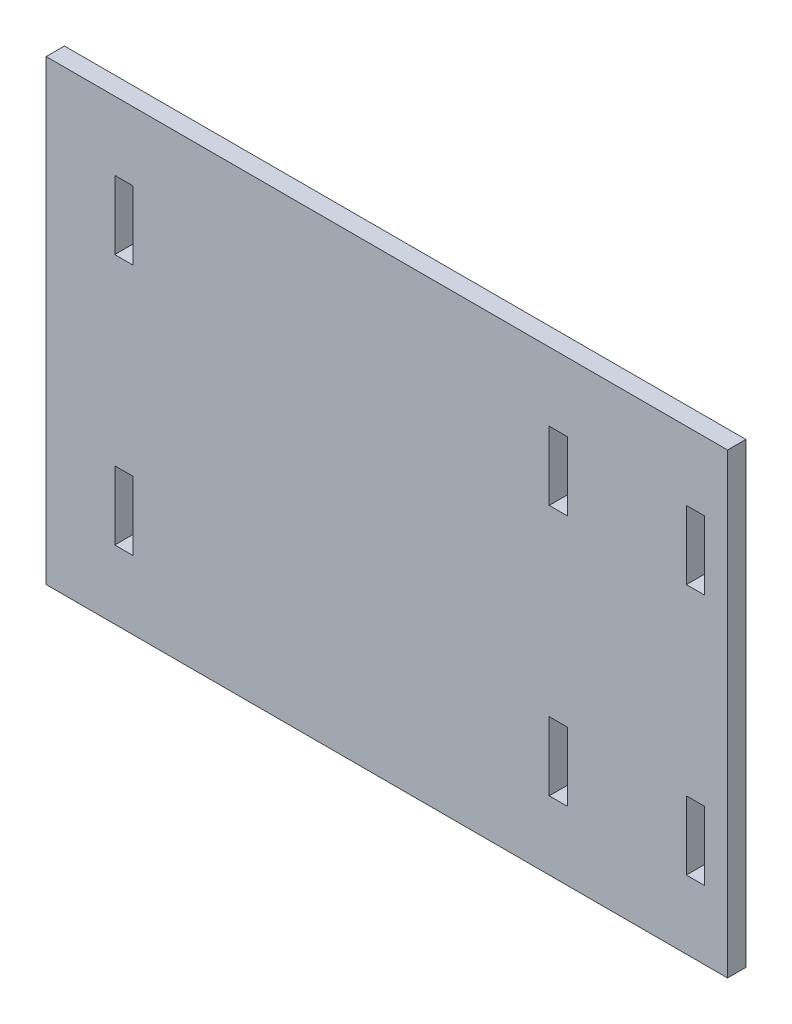
ISO-10303-21;
HEADER;
FILE_DESCRIPTION(('STEP AP214'),'2;1');
FILE_NAME('part.step','',(''),(''),'','','');
FILE_SCHEMA(('AUTOMOTIVE_DESIGN { 1 0 10303 214 1 1 1 1 }'));
ENDSEC;
DATA;
#1=APPLICATION_CONTEXT('core data for automotive mechanical design processes');
#2=APPLICATION_PROTOCOL_DEFINITION('international standard','automotive_design',2000,#1);
#3=PRODUCT_CONTEXT('',#1,'mechanical');
#4=PRODUCT('Part','Part','',(#3));
#5=PRODUCT_RELATED_PRODUCT_CATEGORY('part','',(#4));
#6=PRODUCT_DEFINITION_FORMATION('','',#4);
#7=PRODUCT_DEFINITION_CONTEXT('part definition',#1,'design');
#8=PRODUCT_DEFINITION('design','',#6,#7);
#9=PRODUCT_DEFINITION_SHAPE('','',#8);
#10=(LENGTH_UNIT() NAMED_UNIT(*) SI_UNIT(.MILLI.,.METRE.));
#11=(NAMED_UNIT(*) PLANE_ANGLE_UNIT() SI_UNIT($,.RADIAN.));
#12=(NAMED_UNIT(*) SI_UNIT($,.STERADIAN.) SOLID_ANGLE_UNIT());
#13=UNCERTAINTY_MEASURE_WITH_UNIT(LENGTH_MEASURE(1.E-05),#10,'distance_accuracy_value','');
#14=(GEOMETRIC_REPRESENTATION_CONTEXT(3) GLOBAL_UNCERTAINTY_ASSIGNED_CONTEXT((#13)) GLOBAL_UNIT_ASSIGNED_CONTEXT((#10,
#11,#12)) REPRESENTATION_CONTEXT('',''));
#15=CARTESIAN_POINT('',(0.,0.,0.));
#16=DIRECTION('',(0.,0.,1.));
#17=DIRECTION('',(1.,0.,0.));
#18=AXIS2_PLACEMENT_3D('',#15,#16,#17);
#19=CARTESIAN_POINT('',(0.,0.,4.));
#20=DIRECTION('',(0.,0.,-1.));
#21=DIRECTION('',(-1.,0.,0.));
#22=AXIS2_PLACEMENT_3D('',#19,#20,#21);
#23=PLANE('',#22);
#24=DIRECTION('',(0.,-1.,0.));
#25=VECTOR('',#24,1.);
#26=CARTESIAN_POINT('',(75.5,34.9999999999999,4.));
#27=LINE('',#26,#25);
#28=CARTESIAN_POINT('',(75.5,34.9999999999999,4.));
#29=VERTEX_POINT('',#28);
#30=CARTESIAN_POINT('',(75.5,19.9999999999999,4.));
#31=VERTEX_POINT('',#30);
#32=EDGE_CURVE('E254',#29,#31,#27,.T.);
#33=ORIENTED_EDGE('',*,*,#32,.F.);
#34=DIRECTION('',(-1.,0.,0.));
#35=VECTOR('',#34,1.);
#36=CARTESIAN_POINT('',(75.5,34.9999999999999,4.));
#37=LINE('',#36,#35);
#38=CARTESIAN_POINT('',(79.5,34.9999999999999,4.));
#39=VERTEX_POINT('',#38);
#40=EDGE_CURVE('E262',#39,#29,#37,.T.);
#41=ORIENTED_EDGE('',*,*,#40,.F.);
#42=DIRECTION('',(0.,1.,0.));
#43=VECTOR('',#42,1.);
#44=CARTESIAN_POINT('',(79.5,34.9999999999999,4.));
#45=LINE('',#44,#43);
#46=CARTESIAN_POINT('',(79.5,19.9999999999999,4.));
#47=VERTEX_POINT('',#46);
#48=EDGE_CURVE('E259',#47,#39,#45,.T.);
#49=ORIENTED_EDGE('',*,*,#48,.F.);
#50=DIRECTION('',(1.,0.,0.));
#51=VECTOR('',#50,1.);
#52=CARTESIAN_POINT('',(75.5,19.9999999999999,4.));
#53=LINE('',#52,#51);
#54=EDGE_CURVE('E256',#31,#47,#53,.T.);
#55=ORIENTED_EDGE('',*,*,#54,.F.);
#56=EDGE_LOOP('',(#33,#41,#49,#55));
#57=FACE_BOUND('',#56,.T.);
#58=DIRECTION('',(0.,1.,0.));
#59=VECTOR('',#58,1.);
#60=CARTESIAN_POINT('',(-45.5,35.,4.));
#61=LINE('',#60,#59);
#62=CARTESIAN_POINT('',(-45.5,20.,4.));
#63=VERTEX_POINT('',#62);
#64=CARTESIAN_POINT('',(-45.5,35.,4.));
#65=VERTEX_POINT('',#64);
#66=EDGE_CURVE('E316',#63,#65,#61,.T.);
#67=ORIENTED_EDGE('',*,*,#66,.F.);
#68=DIRECTION('',(1.,0.,0.));
#69=VECTOR('',#68,1.);
#70=CARTESIAN_POINT('',(-45.5,20.,4.));
#71=LINE('',#70,#69);
#72=CARTESIAN_POINT('',(-49.5,20.,4.));
#73=VERTEX_POINT('',#72);
#74=EDGE_CURVE('E324',#73,#63,#71,.T.);
#75=ORIENTED_EDGE('',*,*,#74,.F.);
#76=DIRECTION('',(0.,-1.,0.));
#77=VECTOR('',#76,1.);
#78=CARTESIAN_POINT('',(-49.5,35.,4.));
#79=LINE('',#78,#77);
#80=CARTESIAN_POINT('',(-49.5,35.,4.));
#81=VERTEX_POINT('',#80);
#82=EDGE_CURVE('E321',#81,#73,#79,.T.);
#83=ORIENTED_EDGE('',*,*,#82,.F.);
#84=DIRECTION('',(-1.,0.,0.));
#85=VECTOR('',#84,1.);
#86=CARTESIAN_POINT('',(-45.5,35.,4.));
#87=LINE('',#86,#85);
#88=EDGE_CURVE('E318',#65,#81,#87,.T.);
#89=ORIENTED_EDGE('',*,*,#88,.F.);
#90=EDGE_LOOP('',(#67,#75,#83,#89));
#91=FACE_BOUND('',#90,.T.);
#92=DIRECTION('',(0.,-1.,0.));
#93=VECTOR('',#92,1.);
#94=CARTESIAN_POINT('',(45.5,34.9999999999999,4.));
#95=LINE('',#94,#93);
#96=CARTESIAN_POINT('',(45.5,34.9999999999999,4.));
#97=VERTEX_POINT('',#96);
#98=CARTESIAN_POINT('',(45.5,19.9999999999999,4.));
#99=VERTEX_POINT('',#98);
#100=EDGE_CURVE('E378',#97,#99,#95,.T.);
#101=ORIENTED_EDGE('',*,*,#100,.F.);
#102=DIRECTION('',(-1.,0.,0.));
#103=VECTOR('',#102,1.);
#104=CARTESIAN_POINT('',(45.5,34.9999999999999,4.));
#105=LINE('',#104,#103);
#106=CARTESIAN_POINT('',(49.5,34.9999999999999,4.));
#107=VERTEX_POINT('',#106);
#108=EDGE_CURVE('E386',#107,#97,#105,.T.);
#109=ORIENTED_EDGE('',*,*,#108,.F.);
#110=DIRECTION('',(0.,1.,0.));
#111=VECTOR('',#110,1.);
#112=CARTESIAN_POINT('',(49.5,34.9999999999999,4.));
#113=LINE('',#112,#111);
#114=CARTESIAN_POINT('',(49.5,19.9999999999999,4.));
#115=VERTEX_POINT('',#114);
#116=EDGE_CURVE('E383',#115,#107,#113,.T.);
#117=ORIENTED_EDGE('',*,*,#116,.F.);
#118=DIRECTION('',(1.,0.,0.));
#119=VECTOR('',#118,1.);
#120=CARTESIAN_POINT('',(45.5,19.9999999999999,4.));
#121=LINE('',#120,#119);
#122=EDGE_CURVE('E380',#99,#115,#121,.T.);
#123=ORIENTED_EDGE('',*,*,#122,.F.);
#124=EDGE_LOOP('',(#101,#109,#117,#123));
#125=FACE_BOUND('',#124,.T.);
#126=DIRECTION('',(-1.,0.,0.));
#127=VECTOR('',#126,1.);
#128=CARTESIAN_POINT('',(64.5,49.9999999999999,4.));
#129=LINE('',#128,#127);
#130=CARTESIAN_POINT('',(84.5,49.9999999999999,4.));
#131=VERTEX_POINT('',#130);
#132=CARTESIAN_POINT('',(-64.4999999999997,49.9999999999999,4.));
#133=VERTEX_POINT('',#132);
#134=EDGE_CURVE('E409',#131,#133,#129,.T.);
#135=ORIENTED_EDGE('',*,*,#134,.T.);
#136=DIRECTION('',(0.,-1.,0.));
#137=VECTOR('',#136,1.);
#138=CARTESIAN_POINT('',(-64.4999999999997,-50.0000000000001,4.));
#139=LINE('',#138,#137);
#140=CARTESIAN_POINT('',(-64.4999999999997,-50.0000000000001,4.));
#141=VERTEX_POINT('',#140);
#142=EDGE_CURVE('E411',#133,#141,#139,.T.);
#143=ORIENTED_EDGE('',*,*,#142,.T.);
#144=DIRECTION('',(1.,0.,0.));
#145=VECTOR('',#144,1.);
#146=CARTESIAN_POINT('',(-64.4999999999997,-50.0000000000001,4.));
#147=LINE('',#146,#145);
#148=CARTESIAN_POINT('',(84.5,-50.0000000000001,4.));
#149=VERTEX_POINT('',#148);
#150=EDGE_CURVE('E414',#141,#149,#147,.T.);
#151=ORIENTED_EDGE('',*,*,#150,.T.);
#152=DIRECTION('',(0.,1.,0.));
#153=VECTOR('',#152,1.);
#154=CARTESIAN_POINT('',(84.5,49.9999999999999,4.));
#155=LINE('',#154,#153);
#156=EDGE_CURVE('E416',#149,#131,#155,.T.);
#157=ORIENTED_EDGE('',*,*,#156,.T.);
#158=EDGE_LOOP('',(#135,#143,#151,#157));
#159=FACE_BOUND('',#158,.T.);
#160=DIRECTION('',(0.,-1.,0.));
#161=VECTOR('',#160,1.);
#162=CARTESIAN_POINT('',(45.5,-34.9999999999999,4.));
#163=LINE('',#162,#161);
#164=CARTESIAN_POINT('',(45.5,-19.9999999999999,4.));
#165=VERTEX_POINT('',#164);
#166=CARTESIAN_POINT('',(45.5,-34.9999999999999,4.));
#167=VERTEX_POINT('',#166);
#168=EDGE_CURVE('E347',#165,#167,#163,.T.);
#169=ORIENTED_EDGE('',*,*,#168,.F.);
#170=DIRECTION('',(-1.,0.,0.));
#171=VECTOR('',#170,1.);
#172=CARTESIAN_POINT('',(45.5,-19.9999999999999,4.));
#173=LINE('',#172,#171);
#174=CARTESIAN_POINT('',(49.5,-19.9999999999999,4.));
#175=VERTEX_POINT('',#174);
#176=EDGE_CURVE('E355',#175,#165,#173,.T.);
#177=ORIENTED_EDGE('',*,*,#176,.F.);
#178=DIRECTION('',(0.,1.,0.));
#179=VECTOR('',#178,1.);
#180=CARTESIAN_POINT('',(49.5,-34.9999999999999,4.));
#181=LINE('',#180,#179);
#182=CARTESIAN_POINT('',(49.5,-34.9999999999999,4.));
#183=VERTEX_POINT('',#182);
#184=EDGE_CURVE('E352',#183,#175,#181,.T.);
#185=ORIENTED_EDGE('',*,*,#184,.F.);
#186=DIRECTION('',(1.,0.,0.));
#187=VECTOR('',#186,1.);
#188=CARTESIAN_POINT('',(45.5,-34.9999999999999,4.));
#189=LINE('',#188,#187);
#190=EDGE_CURVE('E349',#167,#183,#189,.T.);
#191=ORIENTED_EDGE('',*,*,#190,.F.);
#192=EDGE_LOOP('',(#169,#177,#185,#191));
#193=FACE_BOUND('',#192,.T.);
#194=DIRECTION('',(0.,1.,0.));
#195=VECTOR('',#194,1.);
#196=CARTESIAN_POINT('',(-45.5,-35.,4.));
#197=LINE('',#196,#195);
#198=CARTESIAN_POINT('',(-45.5,-35.,4.));
#199=VERTEX_POINT('',#198);
#200=CARTESIAN_POINT('',(-45.5,-20.,4.));
#201=VERTEX_POINT('',#200);
#202=EDGE_CURVE('E285',#199,#201,#197,.T.);
#203=ORIENTED_EDGE('',*,*,#202,.F.);
#204=DIRECTION('',(1.,0.,0.));
#205=VECTOR('',#204,1.);
#206=CARTESIAN_POINT('',(-45.5,-35.,4.));
#207=LINE('',#206,#205);
#208=CARTESIAN_POINT('',(-49.5,-35.,4.));
#209=VERTEX_POINT('',#208);
#210=EDGE_CURVE('E293',#209,#199,#207,.T.);
#211=ORIENTED_EDGE('',*,*,#210,.F.);
#212=DIRECTION('',(0.,-1.,0.));
#213=VECTOR('',#212,1.);
#214=CARTESIAN_POINT('',(-49.5,-35.,4.));
#215=LINE('',#214,#213);
#216=CARTESIAN_POINT('',(-49.5,-20.,4.));
#217=VERTEX_POINT('',#216);
#218=EDGE_CURVE('E290',#217,#209,#215,.T.);
#219=ORIENTED_EDGE('',*,*,#218,.F.);
#220=DIRECTION('',(-1.,0.,0.));
#221=VECTOR('',#220,1.);
#222=CARTESIAN_POINT('',(-45.5,-20.,4.));
#223=LINE('',#222,#221);
#224=EDGE_CURVE('E287',#201,#217,#223,.T.);
#225=ORIENTED_EDGE('',*,*,#224,.F.);
#226=EDGE_LOOP('',(#203,#211,#219,#225));
#227=FACE_BOUND('',#226,.T.);
#228=DIRECTION('',(0.,-1.,0.));
#229=VECTOR('',#228,1.);
#230=CARTESIAN_POINT('',(75.5,-20.,4.));
#231=LINE('',#230,#229);
#232=CARTESIAN_POINT('',(75.5,-20.,4.));
#233=VERTEX_POINT('',#232);
#234=CARTESIAN_POINT('',(75.5,-35.,4.));
#235=VERTEX_POINT('',#234);
#236=EDGE_CURVE('E218',#233,#235,#231,.T.);
#237=ORIENTED_EDGE('',*,*,#236,.F.);
#238=DIRECTION('',(-1.,0.,0.));
#239=VECTOR('',#238,1.);
#240=CARTESIAN_POINT('',(75.5,-20.,4.));
#241=LINE('',#240,#239);
#242=CARTESIAN_POINT('',(79.5,-20.,4.));
#243=VERTEX_POINT('',#242);
#244=EDGE_CURVE('E240',#243,#233,#241,.T.);
#245=ORIENTED_EDGE('',*,*,#244,.F.);
#246=DIRECTION('',(0.,1.,0.));
#247=VECTOR('',#246,1.);
#248=CARTESIAN_POINT('',(79.5,-20.,4.));
#249=LINE('',#248,#247);
#250=CARTESIAN_POINT('',(79.5,-35.,4.));
#251=VERTEX_POINT('',#250);
#252=EDGE_CURVE('E238',#251,#243,#249,.T.);
#253=ORIENTED_EDGE('',*,*,#252,.F.);
#254=DIRECTION('',(1.,0.,0.));
#255=VECTOR('',#254,1.);
#256=CARTESIAN_POINT('',(75.5,-35.,4.));
#257=LINE('',#256,#255);
#258=EDGE_CURVE('E226',#235,#251,#257,.T.);
#259=ORIENTED_EDGE('',*,*,#258,.F.);
#260=EDGE_LOOP('',(#237,#245,#253,#259));
#261=FACE_BOUND('',#260,.T.);
#262=ADVANCED_FACE('F33',(#57,#91,#125,#159,#193,#227,#261),#23,.F.);
#263=CARTESIAN_POINT('',(0.,0.,0.));
#264=DIRECTION('',(0.,0.,-1.));
#265=DIRECTION('',(-1.,0.,0.));
#266=AXIS2_PLACEMENT_3D('',#263,#264,#265);
#267=PLANE('',#266);
#268=DIRECTION('',(-1.,0.,0.));
#269=VECTOR('',#268,1.);
#270=CARTESIAN_POINT('',(-64.4999999999997,49.9999999999999,0.));
#271=LINE('',#270,#269);
#272=CARTESIAN_POINT('',(84.5,49.9999999999999,0.));
#273=VERTEX_POINT('',#272);
#274=CARTESIAN_POINT('',(-64.4999999999997,49.9999999999999,0.));
#275=VERTEX_POINT('',#274);
#276=EDGE_CURVE('E408',#273,#275,#271,.T.);
#277=ORIENTED_EDGE('',*,*,#276,.F.);
#278=DIRECTION('',(0.,1.,0.));
#279=VECTOR('',#278,1.);
#280=CARTESIAN_POINT('',(84.5,49.9999999999999,0.));
#281=LINE('',#280,#279);
#282=CARTESIAN_POINT('',(84.5,-50.0000000000001,0.));
#283=VERTEX_POINT('',#282);
#284=EDGE_CURVE('E412',#283,#273,#281,.T.);
#285=ORIENTED_EDGE('',*,*,#284,.F.);
#286=DIRECTION('',(1.,0.,0.));
#287=VECTOR('',#286,1.);
#288=CARTESIAN_POINT('',(84.5,-50.0000000000001,0.));
#289=LINE('',#288,#287);
#290=CARTESIAN_POINT('',(-64.4999999999997,-50.0000000000001,0.));
#291=VERTEX_POINT('',#290);
#292=EDGE_CURVE('E423',#291,#283,#289,.T.);
#293=ORIENTED_EDGE('',*,*,#292,.F.);
#294=DIRECTION('',(0.,-1.,0.));
#295=VECTOR('',#294,1.);
#296=CARTESIAN_POINT('',(-64.4999999999997,-50.0000000000001,0.));
#297=LINE('',#296,#295);
#298=EDGE_CURVE('E420',#275,#291,#297,.T.);
#299=ORIENTED_EDGE('',*,*,#298,.F.);
#300=EDGE_LOOP('',(#277,#285,#293,#299));
#301=FACE_BOUND('',#300,.T.);
#302=DIRECTION('',(-1.,0.,0.));
#303=VECTOR('',#302,1.);
#304=CARTESIAN_POINT('',(45.5,34.9999999999999,0.));
#305=LINE('',#304,#303);
#306=CARTESIAN_POINT('',(49.5,34.9999999999999,0.));
#307=VERTEX_POINT('',#306);
#308=CARTESIAN_POINT('',(45.5,34.9999999999999,0.));
#309=VERTEX_POINT('',#308);
#310=EDGE_CURVE('E381',#307,#309,#305,.T.);
#311=ORIENTED_EDGE('',*,*,#310,.T.);
#312=DIRECTION('',(0.,-1.,0.));
#313=VECTOR('',#312,1.);
#314=CARTESIAN_POINT('',(45.5,34.9999999999999,0.));
#315=LINE('',#314,#313);
#316=CARTESIAN_POINT('',(45.5,19.9999999999999,0.));
#317=VERTEX_POINT('',#316);
#318=EDGE_CURVE('E377',#309,#317,#315,.T.);
#319=ORIENTED_EDGE('',*,*,#318,.T.);
#320=DIRECTION('',(1.,0.,0.));
#321=VECTOR('',#320,1.);
#322=CARTESIAN_POINT('',(45.5,19.9999999999999,0.));
#323=LINE('',#322,#321);
#324=CARTESIAN_POINT('',(49.5,19.9999999999999,0.));
#325=VERTEX_POINT('',#324);
#326=EDGE_CURVE('E391',#317,#325,#323,.T.);
#327=ORIENTED_EDGE('',*,*,#326,.T.);
#328=DIRECTION('',(0.,1.,0.));
#329=VECTOR('',#328,1.);
#330=CARTESIAN_POINT('',(49.5,34.9999999999999,0.));
#331=LINE('',#330,#329);
#332=EDGE_CURVE('E394',#325,#307,#331,.T.);
#333=ORIENTED_EDGE('',*,*,#332,.T.);
#334=EDGE_LOOP('',(#311,#319,#327,#333));
#335=FACE_BOUND('',#334,.T.);
#336=DIRECTION('',(-1.,0.,0.));
#337=VECTOR('',#336,1.);
#338=CARTESIAN_POINT('',(45.5,-19.9999999999999,0.));
#339=LINE('',#338,#337);
#340=CARTESIAN_POINT('',(49.5,-19.9999999999999,0.));
#341=VERTEX_POINT('',#340);
#342=CARTESIAN_POINT('',(45.5,-19.9999999999999,0.));
#343=VERTEX_POINT('',#342);
#344=EDGE_CURVE('E350',#341,#343,#339,.T.);
#345=ORIENTED_EDGE('',*,*,#344,.T.);
#346=DIRECTION('',(0.,-1.,0.));
#347=VECTOR('',#346,1.);
#348=CARTESIAN_POINT('',(45.5,-34.9999999999999,0.));
#349=LINE('',#348,#347);
#350=CARTESIAN_POINT('',(45.5,-34.9999999999999,0.));
#351=VERTEX_POINT('',#350);
#352=EDGE_CURVE('E346',#343,#351,#349,.T.);
#353=ORIENTED_EDGE('',*,*,#352,.T.);
#354=DIRECTION('',(1.,0.,0.));
#355=VECTOR('',#354,1.);
#356=CARTESIAN_POINT('',(45.5,-34.9999999999999,0.));
#357=LINE('',#356,#355);
#358=CARTESIAN_POINT('',(49.5,-34.9999999999999,0.));
#359=VERTEX_POINT('',#358);
#360=EDGE_CURVE('E360',#351,#359,#357,.T.);
#361=ORIENTED_EDGE('',*,*,#360,.T.);
#362=DIRECTION('',(0.,1.,0.));
#363=VECTOR('',#362,1.);
#364=CARTESIAN_POINT('',(49.5,-34.9999999999999,0.));
#365=LINE('',#364,#363);
#366=EDGE_CURVE('E363',#359,#341,#365,.T.);
#367=ORIENTED_EDGE('',*,*,#366,.T.);
#368=EDGE_LOOP('',(#345,#353,#361,#367));
#369=FACE_BOUND('',#368,.T.);
#370=DIRECTION('',(1.,0.,0.));
#371=VECTOR('',#370,1.);
#372=CARTESIAN_POINT('',(-45.5,20.,0.));
#373=LINE('',#372,#371);
#374=CARTESIAN_POINT('',(-49.5,20.,0.));
#375=VERTEX_POINT('',#374);
#376=CARTESIAN_POINT('',(-45.5,20.,0.));
#377=VERTEX_POINT('',#376);
#378=EDGE_CURVE('E319',#375,#377,#373,.T.);
#379=ORIENTED_EDGE('',*,*,#378,.T.);
#380=DIRECTION('',(0.,1.,0.));
#381=VECTOR('',#380,1.);
#382=CARTESIAN_POINT('',(-45.5,35.,0.));
#383=LINE('',#382,#381);
#384=CARTESIAN_POINT('',(-45.5,35.,0.));
#385=VERTEX_POINT('',#384);
#386=EDGE_CURVE('E315',#377,#385,#383,.T.);
#387=ORIENTED_EDGE('',*,*,#386,.T.);
#388=DIRECTION('',(-1.,0.,0.));
#389=VECTOR('',#388,1.);
#390=CARTESIAN_POINT('',(-45.5,35.,0.));
#391=LINE('',#390,#389);
#392=CARTESIAN_POINT('',(-49.5,35.,0.));
#393=VERTEX_POINT('',#392);
#394=EDGE_CURVE('E329',#385,#393,#391,.T.);
#395=ORIENTED_EDGE('',*,*,#394,.T.);
#396=DIRECTION('',(0.,-1.,0.));
#397=VECTOR('',#396,1.);
#398=CARTESIAN_POINT('',(-49.5,35.,0.));
#399=LINE('',#398,#397);
#400=EDGE_CURVE('E332',#393,#375,#399,.T.);
#401=ORIENTED_EDGE('',*,*,#400,.T.);
#402=EDGE_LOOP('',(#379,#387,#395,#401));
#403=FACE_BOUND('',#402,.T.);
#404=DIRECTION('',(1.,0.,0.));
#405=VECTOR('',#404,1.);
#406=CARTESIAN_POINT('',(-45.5,-35.,0.));
#407=LINE('',#406,#405);
#408=CARTESIAN_POINT('',(-49.5,-35.,0.));
#409=VERTEX_POINT('',#408);
#410=CARTESIAN_POINT('',(-45.5,-35.,0.));
#411=VERTEX_POINT('',#410);
#412=EDGE_CURVE('E288',#409,#411,#407,.T.);
#413=ORIENTED_EDGE('',*,*,#412,.T.);
#414=DIRECTION('',(0.,1.,0.));
#415=VECTOR('',#414,1.);
#416=CARTESIAN_POINT('',(-45.5,-35.,0.));
#417=LINE('',#416,#415);
#418=CARTESIAN_POINT('',(-45.5,-20.,0.));
#419=VERTEX_POINT('',#418);
#420=EDGE_CURVE('E284',#411,#419,#417,.T.);
#421=ORIENTED_EDGE('',*,*,#420,.T.);
#422=DIRECTION('',(-1.,0.,0.));
#423=VECTOR('',#422,1.);
#424=CARTESIAN_POINT('',(-45.5,-20.,0.));
#425=LINE('',#424,#423);
#426=CARTESIAN_POINT('',(-49.5,-20.,0.));
#427=VERTEX_POINT('',#426);
#428=EDGE_CURVE('E298',#419,#427,#425,.T.);
#429=ORIENTED_EDGE('',*,*,#428,.T.);
#430=DIRECTION('',(0.,-1.,0.));
#431=VECTOR('',#430,1.);
#432=CARTESIAN_POINT('',(-49.5,-35.,0.));
#433=LINE('',#432,#431);
#434=EDGE_CURVE('E301',#427,#409,#433,.T.);
#435=ORIENTED_EDGE('',*,*,#434,.T.);
#436=EDGE_LOOP('',(#413,#421,#429,#435));
#437=FACE_BOUND('',#436,.T.);
#438=DIRECTION('',(-1.,0.,0.));
#439=VECTOR('',#438,1.);
#440=CARTESIAN_POINT('',(75.5,34.9999999999999,0.));
#441=LINE('',#440,#439);
#442=CARTESIAN_POINT('',(79.5,34.9999999999999,0.));
#443=VERTEX_POINT('',#442);
#444=CARTESIAN_POINT('',(75.5,34.9999999999999,0.));
#445=VERTEX_POINT('',#444);
#446=EDGE_CURVE('E257',#443,#445,#441,.T.);
#447=ORIENTED_EDGE('',*,*,#446,.T.);
#448=DIRECTION('',(0.,-1.,0.));
#449=VECTOR('',#448,1.);
#450=CARTESIAN_POINT('',(75.5,34.9999999999999,0.));
#451=LINE('',#450,#449);
#452=CARTESIAN_POINT('',(75.5,19.9999999999999,0.));
#453=VERTEX_POINT('',#452);
#454=EDGE_CURVE('E234',#445,#453,#451,.T.);
#455=ORIENTED_EDGE('',*,*,#454,.T.);
#456=DIRECTION('',(1.,0.,0.));
#457=VECTOR('',#456,1.);
#458=CARTESIAN_POINT('',(75.5,19.9999999999999,0.));
#459=LINE('',#458,#457);
#460=CARTESIAN_POINT('',(79.5,19.9999999999999,0.));
#461=VERTEX_POINT('',#460);
#462=EDGE_CURVE('E267',#453,#461,#459,.T.);
#463=ORIENTED_EDGE('',*,*,#462,.T.);
#464=DIRECTION('',(0.,1.,0.));
#465=VECTOR('',#464,1.);
#466=CARTESIAN_POINT('',(79.5,34.9999999999999,0.));
#467=LINE('',#466,#465);
#468=EDGE_CURVE('E270',#461,#443,#467,.T.);
#469=ORIENTED_EDGE('',*,*,#468,.T.);
#470=EDGE_LOOP('',(#447,#455,#463,#469));
#471=FACE_BOUND('',#470,.T.);
#472=DIRECTION('',(-1.,0.,0.));
#473=VECTOR('',#472,1.);
#474=CARTESIAN_POINT('',(75.5,-20.,0.));
#475=LINE('',#474,#473);
#476=CARTESIAN_POINT('',(79.5,-20.,0.));
#477=VERTEX_POINT('',#476);
#478=CARTESIAN_POINT('',(75.5,-20.,0.));
#479=VERTEX_POINT('',#478);
#480=EDGE_CURVE('E227',#477,#479,#475,.T.);
#481=ORIENTED_EDGE('',*,*,#480,.T.);
#482=DIRECTION('',(0.,-1.,0.));
#483=VECTOR('',#482,1.);
#484=CARTESIAN_POINT('',(75.5,-20.,0.));
#485=LINE('',#484,#483);
#486=CARTESIAN_POINT('',(75.5,-35.,0.));
#487=VERTEX_POINT('',#486);
#488=EDGE_CURVE('E56',#479,#487,#485,.T.);
#489=ORIENTED_EDGE('',*,*,#488,.T.);
#490=DIRECTION('',(1.,0.,0.));
#491=VECTOR('',#490,1.);
#492=CARTESIAN_POINT('',(75.5,-35.,0.));
#493=LINE('',#492,#491);
#494=CARTESIAN_POINT('',(79.5,-35.,0.));
#495=VERTEX_POINT('',#494);
#496=EDGE_CURVE('E233',#487,#495,#493,.T.);
#497=ORIENTED_EDGE('',*,*,#496,.T.);
#498=DIRECTION('',(0.,1.,0.));
#499=VECTOR('',#498,1.);
#500=CARTESIAN_POINT('',(79.5,-20.,0.));
#501=LINE('',#500,#499);
#502=EDGE_CURVE('E246',#495,#477,#501,.T.);
#503=ORIENTED_EDGE('',*,*,#502,.T.);
#504=EDGE_LOOP('',(#481,#489,#497,#503));
#505=FACE_BOUND('',#504,.T.);
#506=ADVANCED_FACE('F443',(#301,#335,#369,#403,#437,#471,#505),#267,.T.);
#507=CARTESIAN_POINT('',(-64.4999999999997,49.9999999999999,4.));
#508=DIRECTION('',(0.,-1.,0.));
#509=DIRECTION('',(0.,0.,-1.));
#510=AXIS2_PLACEMENT_3D('',#507,#508,#509);
#511=PLANE('',#510);
#512=ORIENTED_EDGE('',*,*,#276,.T.);
#513=DIRECTION('',(0.,0.,-1.));
#514=VECTOR('',#513,1.);
#515=CARTESIAN_POINT('',(-64.4999999999997,49.9999999999999,4.));
#516=LINE('',#515,#514);
#517=EDGE_CURVE('E11',#133,#275,#516,.T.);
#518=ORIENTED_EDGE('',*,*,#517,.F.);
#519=ORIENTED_EDGE('',*,*,#134,.F.);
#520=DIRECTION('',(0.,0.,-1.));
#521=VECTOR('',#520,1.);
#522=CARTESIAN_POINT('',(84.5,49.9999999999999,4.));
#523=LINE('',#522,#521);
#524=EDGE_CURVE('E418',#131,#273,#523,.T.);
#525=ORIENTED_EDGE('',*,*,#524,.T.);
#526=EDGE_LOOP('',(#512,#518,#519,#525));
#527=FACE_BOUND('',#526,.T.);
#528=ADVANCED_FACE('F35',(#527),#511,.F.);
#529=CARTESIAN_POINT('',(-64.4999999999997,-50.0000000000001,4.));
#530=DIRECTION('',(1.,0.,0.));
#531=DIRECTION('',(0.,0.,-1.));
#532=AXIS2_PLACEMENT_3D('',#529,#530,#531);
#533=PLANE('',#532);
#534=ORIENTED_EDGE('',*,*,#298,.T.);
#535=DIRECTION('',(0.,0.,-1.));
#536=VECTOR('',#535,1.);
#537=CARTESIAN_POINT('',(-64.4999999999997,-50.0000000000001,4.));
#538=LINE('',#537,#536);
#539=EDGE_CURVE('E41',#141,#291,#538,.T.);
#540=ORIENTED_EDGE('',*,*,#539,.F.);
#541=ORIENTED_EDGE('',*,*,#142,.F.);
#542=ORIENTED_EDGE('',*,*,#517,.T.);
#543=EDGE_LOOP('',(#534,#540,#541,#542));
#544=FACE_BOUND('',#543,.T.);
#545=ADVANCED_FACE('F439',(#544),#533,.F.);
#546=CARTESIAN_POINT('',(84.5,-50.0000000000001,4.));
#547=DIRECTION('',(0.,1.,0.));
#548=DIRECTION('',(0.,0.,1.));
#549=AXIS2_PLACEMENT_3D('',#546,#547,#548);
#550=PLANE('',#549);
#551=ORIENTED_EDGE('',*,*,#292,.T.);
#552=DIRECTION('',(0.,0.,-1.));
#553=VECTOR('',#552,1.);
#554=CARTESIAN_POINT('',(84.5,-50.0000000000001,4.));
#555=LINE('',#554,#553);
#556=EDGE_CURVE('E429',#149,#283,#555,.T.);
#557=ORIENTED_EDGE('',*,*,#556,.F.);
#558=ORIENTED_EDGE('',*,*,#150,.F.);
#559=ORIENTED_EDGE('',*,*,#539,.T.);
#560=EDGE_LOOP('',(#551,#557,#558,#559));
#561=FACE_BOUND('',#560,.T.);
#562=ADVANCED_FACE('F435',(#561),#550,.F.);
#563=CARTESIAN_POINT('',(84.5,49.9999999999999,4.));
#564=DIRECTION('',(-1.,0.,0.));
#565=DIRECTION('',(0.,-1.,0.));
#566=AXIS2_PLACEMENT_3D('',#563,#564,#565);
#567=PLANE('',#566);
#568=ORIENTED_EDGE('',*,*,#284,.T.);
#569=ORIENTED_EDGE('',*,*,#524,.F.);
#570=ORIENTED_EDGE('',*,*,#156,.F.);
#571=ORIENTED_EDGE('',*,*,#556,.T.);
#572=EDGE_LOOP('',(#568,#569,#570,#571));
#573=FACE_BOUND('',#572,.T.);
#574=ADVANCED_FACE('F448',(#573),#567,.F.);
#575=CARTESIAN_POINT('',(45.5,34.9999999999999,4.));
#576=DIRECTION('',(1.,0.,0.));
#577=DIRECTION('',(0.,1.,0.));
#578=AXIS2_PLACEMENT_3D('',#575,#576,#577);
#579=PLANE('',#578);
#580=ORIENTED_EDGE('',*,*,#318,.F.);
#581=DIRECTION('',(0.,0.,-1.));
#582=VECTOR('',#581,1.);
#583=CARTESIAN_POINT('',(45.5,34.9999999999999,4.));
#584=LINE('',#583,#582);
#585=EDGE_CURVE('E388',#97,#309,#584,.T.);
#586=ORIENTED_EDGE('',*,*,#585,.F.);
#587=ORIENTED_EDGE('',*,*,#100,.T.);
#588=DIRECTION('',(0.,0.,-1.));
#589=VECTOR('',#588,1.);
#590=CARTESIAN_POINT('',(45.5,19.9999999999999,4.));
#591=LINE('',#590,#589);
#592=EDGE_CURVE('E405',#99,#317,#591,.T.);
#593=ORIENTED_EDGE('',*,*,#592,.T.);
#594=EDGE_LOOP('',(#580,#586,#587,#593));
#595=FACE_BOUND('',#594,.T.);
#596=ADVANCED_FACE('F536',(#595),#579,.T.);
#597=CARTESIAN_POINT('',(45.5,19.9999999999999,4.));
#598=DIRECTION('',(0.,1.,0.));
#599=DIRECTION('',(0.,0.,1.));
#600=AXIS2_PLACEMENT_3D('',#597,#598,#599);
#601=PLANE('',#600);
#602=ORIENTED_EDGE('',*,*,#326,.F.);
#603=ORIENTED_EDGE('',*,*,#592,.F.);
#604=ORIENTED_EDGE('',*,*,#122,.T.);
#605=DIRECTION('',(0.,0.,-1.));
#606=VECTOR('',#605,1.);
#607=CARTESIAN_POINT('',(49.5,19.9999999999999,4.));
#608=LINE('',#607,#606);
#609=EDGE_CURVE('E403',#115,#325,#608,.T.);
#610=ORIENTED_EDGE('',*,*,#609,.T.);
#611=EDGE_LOOP('',(#602,#603,#604,#610));
#612=FACE_BOUND('',#611,.T.);
#613=ADVANCED_FACE('F532',(#612),#601,.T.);
#614=CARTESIAN_POINT('',(49.5,34.9999999999999,4.));
#615=DIRECTION('',(-1.,0.,0.));
#616=DIRECTION('',(0.,0.,1.));
#617=AXIS2_PLACEMENT_3D('',#614,#615,#616);
#618=PLANE('',#617);
#619=ORIENTED_EDGE('',*,*,#332,.F.);
#620=ORIENTED_EDGE('',*,*,#609,.F.);
#621=ORIENTED_EDGE('',*,*,#116,.T.);
#622=DIRECTION('',(0.,0.,-1.));
#623=VECTOR('',#622,1.);
#624=CARTESIAN_POINT('',(49.5,34.9999999999999,4.));
#625=LINE('',#624,#623);
#626=EDGE_CURVE('E401',#107,#307,#625,.T.);
#627=ORIENTED_EDGE('',*,*,#626,.T.);
#628=EDGE_LOOP('',(#619,#620,#621,#627));
#629=FACE_BOUND('',#628,.T.);
#630=ADVANCED_FACE('F528',(#629),#618,.T.);
#631=CARTESIAN_POINT('',(45.5,34.9999999999999,4.));
#632=DIRECTION('',(0.,-1.,0.));
#633=DIRECTION('',(0.,0.,-1.));
#634=AXIS2_PLACEMENT_3D('',#631,#632,#633);
#635=PLANE('',#634);
#636=ORIENTED_EDGE('',*,*,#310,.F.);
#637=ORIENTED_EDGE('',*,*,#626,.F.);
#638=ORIENTED_EDGE('',*,*,#108,.T.);
#639=ORIENTED_EDGE('',*,*,#585,.T.);
#640=EDGE_LOOP('',(#636,#637,#638,#639));
#641=FACE_BOUND('',#640,.T.);
#642=ADVANCED_FACE('F524',(#641),#635,.T.);
#643=CARTESIAN_POINT('',(45.5,-34.9999999999999,4.));
#644=DIRECTION('',(1.,0.,0.));
#645=DIRECTION('',(0.,1.,0.));
#646=AXIS2_PLACEMENT_3D('',#643,#644,#645);
#647=PLANE('',#646);
#648=ORIENTED_EDGE('',*,*,#352,.F.);
#649=DIRECTION('',(0.,0.,-1.));
#650=VECTOR('',#649,1.);
#651=CARTESIAN_POINT('',(45.5,-19.9999999999999,4.));
#652=LINE('',#651,#650);
#653=EDGE_CURVE('E357',#165,#343,#652,.T.);
#654=ORIENTED_EDGE('',*,*,#653,.F.);
#655=ORIENTED_EDGE('',*,*,#168,.T.);
#656=DIRECTION('',(0.,0.,-1.));
#657=VECTOR('',#656,1.);
#658=CARTESIAN_POINT('',(45.5,-34.9999999999999,4.));
#659=LINE('',#658,#657);
#660=EDGE_CURVE('E374',#167,#351,#659,.T.);
#661=ORIENTED_EDGE('',*,*,#660,.T.);
#662=EDGE_LOOP('',(#648,#654,#655,#661));
#663=FACE_BOUND('',#662,.T.);
#664=ADVANCED_FACE('F520',(#663),#647,.T.);
#665=CARTESIAN_POINT('',(45.5,-34.9999999999999,4.));
#666=DIRECTION('',(0.,1.,0.));
#667=DIRECTION('',(0.,0.,1.));
#668=AXIS2_PLACEMENT_3D('',#665,#666,#667);
#669=PLANE('',#668);
#670=ORIENTED_EDGE('',*,*,#360,.F.);
#671=ORIENTED_EDGE('',*,*,#660,.F.);
#672=ORIENTED_EDGE('',*,*,#190,.T.);
#673=DIRECTION('',(0.,0.,-1.));
#674=VECTOR('',#673,1.);
#675=CARTESIAN_POINT('',(49.5,-34.9999999999999,4.));
#676=LINE('',#675,#674);
#677=EDGE_CURVE('E372',#183,#359,#676,.T.);
#678=ORIENTED_EDGE('',*,*,#677,.T.);
#679=EDGE_LOOP('',(#670,#671,#672,#678));
#680=FACE_BOUND('',#679,.T.);
#681=ADVANCED_FACE('F516',(#680),#669,.T.);
#682=CARTESIAN_POINT('',(49.5,-34.9999999999999,4.));
#683=DIRECTION('',(-1.,0.,0.));
#684=DIRECTION('',(0.,0.,1.));
#685=AXIS2_PLACEMENT_3D('',#682,#683,#684);
#686=PLANE('',#685);
#687=ORIENTED_EDGE('',*,*,#366,.F.);
#688=ORIENTED_EDGE('',*,*,#677,.F.);
#689=ORIENTED_EDGE('',*,*,#184,.T.);
#690=DIRECTION('',(0.,0.,-1.));
#691=VECTOR('',#690,1.);
#692=CARTESIAN_POINT('',(49.5,-19.9999999999999,4.));
#693=LINE('',#692,#691);
#694=EDGE_CURVE('E370',#175,#341,#693,.T.);
#695=ORIENTED_EDGE('',*,*,#694,.T.);
#696=EDGE_LOOP('',(#687,#688,#689,#695));
#697=FACE_BOUND('',#696,.T.);
#698=ADVANCED_FACE('F512',(#697),#686,.T.);
#699=CARTESIAN_POINT('',(45.5,-19.9999999999999,4.));
#700=DIRECTION('',(0.,-1.,0.));
#701=DIRECTION('',(0.,0.,-1.));
#702=AXIS2_PLACEMENT_3D('',#699,#700,#701);
#703=PLANE('',#702);
#704=ORIENTED_EDGE('',*,*,#344,.F.);
#705=ORIENTED_EDGE('',*,*,#694,.F.);
#706=ORIENTED_EDGE('',*,*,#176,.T.);
#707=ORIENTED_EDGE('',*,*,#653,.T.);
#708=EDGE_LOOP('',(#704,#705,#706,#707));
#709=FACE_BOUND('',#708,.T.);
#710=ADVANCED_FACE('F508',(#709),#703,.T.);
#711=CARTESIAN_POINT('',(-45.5,35.,4.));
#712=DIRECTION('',(-1.,0.,0.));
#713=DIRECTION('',(0.,-1.,0.));
#714=AXIS2_PLACEMENT_3D('',#711,#712,#713);
#715=PLANE('',#714);
#716=ORIENTED_EDGE('',*,*,#386,.F.);
#717=DIRECTION('',(0.,0.,-1.));
#718=VECTOR('',#717,1.);
#719=CARTESIAN_POINT('',(-45.5,20.,4.));
#720=LINE('',#719,#718);
#721=EDGE_CURVE('E326',#63,#377,#720,.T.);
#722=ORIENTED_EDGE('',*,*,#721,.F.);
#723=ORIENTED_EDGE('',*,*,#66,.T.);
#724=DIRECTION('',(0.,0.,-1.));
#725=VECTOR('',#724,1.);
#726=CARTESIAN_POINT('',(-45.5,35.,4.));
#727=LINE('',#726,#725);
#728=EDGE_CURVE('E343',#65,#385,#727,.T.);
#729=ORIENTED_EDGE('',*,*,#728,.T.);
#730=EDGE_LOOP('',(#716,#722,#723,#729));
#731=FACE_BOUND('',#730,.T.);
#732=ADVANCED_FACE('F504',(#731),#715,.T.);
#733=CARTESIAN_POINT('',(-45.5,35.,4.));
#734=DIRECTION('',(0.,-1.,0.));
#735=DIRECTION('',(0.,0.,-1.));
#736=AXIS2_PLACEMENT_3D('',#733,#734,#735);
#737=PLANE('',#736);
#738=ORIENTED_EDGE('',*,*,#394,.F.);
#739=ORIENTED_EDGE('',*,*,#728,.F.);
#740=ORIENTED_EDGE('',*,*,#88,.T.);
#741=DIRECTION('',(0.,0.,-1.));
#742=VECTOR('',#741,1.);
#743=CARTESIAN_POINT('',(-49.5,35.,4.));
#744=LINE('',#743,#742);
#745=EDGE_CURVE('E341',#81,#393,#744,.T.);
#746=ORIENTED_EDGE('',*,*,#745,.T.);
#747=EDGE_LOOP('',(#738,#739,#740,#746));
#748=FACE_BOUND('',#747,.T.);
#749=ADVANCED_FACE('F500',(#748),#737,.T.);
#750=CARTESIAN_POINT('',(-49.5,35.,4.));
#751=DIRECTION('',(1.,0.,0.));
#752=DIRECTION('',(0.,0.,-1.));
#753=AXIS2_PLACEMENT_3D('',#750,#751,#752);
#754=PLANE('',#753);
#755=ORIENTED_EDGE('',*,*,#400,.F.);
#756=ORIENTED_EDGE('',*,*,#745,.F.);
#757=ORIENTED_EDGE('',*,*,#82,.T.);
#758=DIRECTION('',(0.,0.,-1.));
#759=VECTOR('',#758,1.);
#760=CARTESIAN_POINT('',(-49.5,20.,4.));
#761=LINE('',#760,#759);
#762=EDGE_CURVE('E339',#73,#375,#761,.T.);
#763=ORIENTED_EDGE('',*,*,#762,.T.);
#764=EDGE_LOOP('',(#755,#756,#757,#763));
#765=FACE_BOUND('',#764,.T.);
#766=ADVANCED_FACE('F496',(#765),#754,.T.);
#767=CARTESIAN_POINT('',(-45.5,20.,4.));
#768=DIRECTION('',(0.,1.,0.));
#769=DIRECTION('',(0.,0.,1.));
#770=AXIS2_PLACEMENT_3D('',#767,#768,#769);
#771=PLANE('',#770);
#772=ORIENTED_EDGE('',*,*,#378,.F.);
#773=ORIENTED_EDGE('',*,*,#762,.F.);
#774=ORIENTED_EDGE('',*,*,#74,.T.);
#775=ORIENTED_EDGE('',*,*,#721,.T.);
#776=EDGE_LOOP('',(#772,#773,#774,#775));
#777=FACE_BOUND('',#776,.T.);
#778=ADVANCED_FACE('F493',(#777),#771,.T.);
#779=CARTESIAN_POINT('',(-45.5,-35.,4.));
#780=DIRECTION('',(-1.,0.,0.));
#781=DIRECTION('',(0.,-1.,0.));
#782=AXIS2_PLACEMENT_3D('',#779,#780,#781);
#783=PLANE('',#782);
#784=ORIENTED_EDGE('',*,*,#420,.F.);
#785=DIRECTION('',(0.,0.,-1.));
#786=VECTOR('',#785,1.);
#787=CARTESIAN_POINT('',(-45.5,-35.,4.));
#788=LINE('',#787,#786);
#789=EDGE_CURVE('E295',#199,#411,#788,.T.);
#790=ORIENTED_EDGE('',*,*,#789,.F.);
#791=ORIENTED_EDGE('',*,*,#202,.T.);
#792=DIRECTION('',(0.,0.,-1.));
#793=VECTOR('',#792,1.);
#794=CARTESIAN_POINT('',(-45.5,-20.,4.));
#795=LINE('',#794,#793);
#796=EDGE_CURVE('E312',#201,#419,#795,.T.);
#797=ORIENTED_EDGE('',*,*,#796,.T.);
#798=EDGE_LOOP('',(#784,#790,#791,#797));
#799=FACE_BOUND('',#798,.T.);
#800=ADVANCED_FACE('F468',(#799),#783,.T.);
#801=CARTESIAN_POINT('',(-45.5,-20.,4.));
#802=DIRECTION('',(0.,-1.,0.));
#803=DIRECTION('',(0.,0.,-1.));
#804=AXIS2_PLACEMENT_3D('',#801,#802,#803);
#805=PLANE('',#804);
#806=ORIENTED_EDGE('',*,*,#428,.F.);
#807=ORIENTED_EDGE('',*,*,#796,.F.);
#808=ORIENTED_EDGE('',*,*,#224,.T.);
#809=DIRECTION('',(0.,0.,-1.));
#810=VECTOR('',#809,1.);
#811=CARTESIAN_POINT('',(-49.5,-20.,4.));
#812=LINE('',#811,#810);
#813=EDGE_CURVE('E310',#217,#427,#812,.T.);
#814=ORIENTED_EDGE('',*,*,#813,.T.);
#815=EDGE_LOOP('',(#806,#807,#808,#814));
#816=FACE_BOUND('',#815,.T.);
#817=ADVANCED_FACE('F470',(#816),#805,.T.);
#818=CARTESIAN_POINT('',(-49.5,-35.,4.));
#819=DIRECTION('',(1.,0.,0.));
#820=DIRECTION('',(0.,0.,-1.));
#821=AXIS2_PLACEMENT_3D('',#818,#819,#820);
#822=PLANE('',#821);
#823=ORIENTED_EDGE('',*,*,#434,.F.);
#824=ORIENTED_EDGE('',*,*,#813,.F.);
#825=ORIENTED_EDGE('',*,*,#218,.T.);
#826=DIRECTION('',(0.,0.,-1.));
#827=VECTOR('',#826,1.);
#828=CARTESIAN_POINT('',(-49.5,-35.,4.));
#829=LINE('',#828,#827);
#830=EDGE_CURVE('E308',#209,#409,#829,.T.);
#831=ORIENTED_EDGE('',*,*,#830,.T.);
#832=EDGE_LOOP('',(#823,#824,#825,#831));
#833=FACE_BOUND('',#832,.T.);
#834=ADVANCED_FACE('F479',(#833),#822,.T.);
#835=CARTESIAN_POINT('',(-45.5,-35.,4.));
#836=DIRECTION('',(0.,1.,0.));
#837=DIRECTION('',(0.,0.,1.));
#838=AXIS2_PLACEMENT_3D('',#835,#836,#837);
#839=PLANE('',#838);
#840=ORIENTED_EDGE('',*,*,#412,.F.);
#841=ORIENTED_EDGE('',*,*,#830,.F.);
#842=ORIENTED_EDGE('',*,*,#210,.T.);
#843=ORIENTED_EDGE('',*,*,#789,.T.);
#844=EDGE_LOOP('',(#840,#841,#842,#843));
#845=FACE_BOUND('',#844,.T.);
#846=ADVANCED_FACE('F477',(#845),#839,.T.);
#847=CARTESIAN_POINT('',(75.5,34.9999999999999,4.));
#848=DIRECTION('',(1.,0.,0.));
#849=DIRECTION('',(0.,0.,-1.));
#850=AXIS2_PLACEMENT_3D('',#847,#848,#849);
#851=PLANE('',#850);
#852=ORIENTED_EDGE('',*,*,#454,.F.);
#853=DIRECTION('',(0.,0.,-1.));
#854=VECTOR('',#853,1.);
#855=CARTESIAN_POINT('',(75.5,34.9999999999999,4.));
#856=LINE('',#855,#854);
#857=EDGE_CURVE('E264',#29,#445,#856,.T.);
#858=ORIENTED_EDGE('',*,*,#857,.F.);
#859=ORIENTED_EDGE('',*,*,#32,.T.);
#860=DIRECTION('',(0.,0.,-1.));
#861=VECTOR('',#860,1.);
#862=CARTESIAN_POINT('',(75.5,19.9999999999999,4.));
#863=LINE('',#862,#861);
#864=EDGE_CURVE('E281',#31,#453,#863,.T.);
#865=ORIENTED_EDGE('',*,*,#864,.T.);
#866=EDGE_LOOP('',(#852,#858,#859,#865));
#867=FACE_BOUND('',#866,.T.);
#868=ADVANCED_FACE('F486',(#867),#851,.T.);
#869=CARTESIAN_POINT('',(75.5,19.9999999999999,4.));
#870=DIRECTION('',(0.,1.,0.));
#871=DIRECTION('',(0.,0.,1.));
#872=AXIS2_PLACEMENT_3D('',#869,#870,#871);
#873=PLANE('',#872);
#874=ORIENTED_EDGE('',*,*,#462,.F.);
#875=ORIENTED_EDGE('',*,*,#864,.F.);
#876=ORIENTED_EDGE('',*,*,#54,.T.);
#877=DIRECTION('',(0.,0.,-1.));
#878=VECTOR('',#877,1.);
#879=CARTESIAN_POINT('',(79.5,19.9999999999999,4.));
#880=LINE('',#879,#878);
#881=EDGE_CURVE('E279',#47,#461,#880,.T.);
#882=ORIENTED_EDGE('',*,*,#881,.T.);
#883=EDGE_LOOP('',(#874,#875,#876,#882));
#884=FACE_BOUND('',#883,.T.);
#885=ADVANCED_FACE('F673',(#884),#873,.T.);
#886=CARTESIAN_POINT('',(79.5,34.9999999999999,4.));
#887=DIRECTION('',(-1.,0.,0.));
#888=DIRECTION('',(0.,0.,1.));
#889=AXIS2_PLACEMENT_3D('',#886,#887,#888);
#890=PLANE('',#889);
#891=ORIENTED_EDGE('',*,*,#468,.F.);
#892=ORIENTED_EDGE('',*,*,#881,.F.);
#893=ORIENTED_EDGE('',*,*,#48,.T.);
#894=DIRECTION('',(0.,0.,-1.));
#895=VECTOR('',#894,1.);
#896=CARTESIAN_POINT('',(79.5,34.9999999999999,4.));
#897=LINE('',#896,#895);
#898=EDGE_CURVE('E277',#39,#443,#897,.T.);
#899=ORIENTED_EDGE('',*,*,#898,.T.);
#900=EDGE_LOOP('',(#891,#892,#893,#899));
#901=FACE_BOUND('',#900,.T.);
#902=ADVANCED_FACE('F681',(#901),#890,.T.);
#903=CARTESIAN_POINT('',(75.5,34.9999999999999,4.));
#904=DIRECTION('',(0.,-1.,0.));
#905=DIRECTION('',(0.,0.,-1.));
#906=AXIS2_PLACEMENT_3D('',#903,#904,#905);
#907=PLANE('',#906);
#908=ORIENTED_EDGE('',*,*,#446,.F.);
#909=ORIENTED_EDGE('',*,*,#898,.F.);
#910=ORIENTED_EDGE('',*,*,#40,.T.);
#911=ORIENTED_EDGE('',*,*,#857,.T.);
#912=EDGE_LOOP('',(#908,#909,#910,#911));
#913=FACE_BOUND('',#912,.T.);
#914=ADVANCED_FACE('F690',(#913),#907,.T.);
#915=CARTESIAN_POINT('',(75.5,-20.,4.));
#916=DIRECTION('',(1.,0.,0.));
#917=DIRECTION('',(0.,0.,-1.));
#918=AXIS2_PLACEMENT_3D('',#915,#916,#917);
#919=PLANE('',#918);
#920=ORIENTED_EDGE('',*,*,#488,.F.);
#921=DIRECTION('',(0.,0.,-1.));
#922=VECTOR('',#921,1.);
#923=CARTESIAN_POINT('',(75.5,-20.,4.));
#924=LINE('',#923,#922);
#925=EDGE_CURVE('E222',#233,#479,#924,.T.);
#926=ORIENTED_EDGE('',*,*,#925,.F.);
#927=ORIENTED_EDGE('',*,*,#236,.T.);
#928=DIRECTION('',(0.,0.,-1.));
#929=VECTOR('',#928,1.);
#930=CARTESIAN_POINT('',(75.5,-35.,4.));
#931=LINE('',#930,#929);
#932=EDGE_CURVE('E221',#235,#487,#931,.T.);
#933=ORIENTED_EDGE('',*,*,#932,.T.);
#934=EDGE_LOOP('',(#920,#926,#927,#933));
#935=FACE_BOUND('',#934,.T.);
#936=ADVANCED_FACE('F220',(#935),#919,.T.);
#937=CARTESIAN_POINT('',(75.5,-35.,4.));
#938=DIRECTION('',(0.,1.,0.));
#939=DIRECTION('',(0.,0.,1.));
#940=AXIS2_PLACEMENT_3D('',#937,#938,#939);
#941=PLANE('',#940);
#942=ORIENTED_EDGE('',*,*,#496,.F.);
#943=ORIENTED_EDGE('',*,*,#932,.F.);
#944=ORIENTED_EDGE('',*,*,#258,.T.);
#945=DIRECTION('',(0.,0.,-1.));
#946=VECTOR('',#945,1.);
#947=CARTESIAN_POINT('',(79.5,-35.,4.));
#948=LINE('',#947,#946);
#949=EDGE_CURVE('E235',#251,#495,#948,.T.);
#950=ORIENTED_EDGE('',*,*,#949,.T.);
#951=EDGE_LOOP('',(#942,#943,#944,#950));
#952=FACE_BOUND('',#951,.T.);
#953=ADVANCED_FACE('F230',(#952),#941,.T.);
#954=CARTESIAN_POINT('',(79.5,-20.,4.));
#955=DIRECTION('',(-1.,0.,0.));
#956=DIRECTION('',(0.,-1.,0.));
#957=AXIS2_PLACEMENT_3D('',#954,#955,#956);
#958=PLANE('',#957);
#959=ORIENTED_EDGE('',*,*,#502,.F.);
#960=ORIENTED_EDGE('',*,*,#949,.F.);
#961=ORIENTED_EDGE('',*,*,#252,.T.);
#962=DIRECTION('',(0.,0.,-1.));
#963=VECTOR('',#962,1.);
#964=CARTESIAN_POINT('',(79.5,-20.,4.));
#965=LINE('',#964,#963);
#966=EDGE_CURVE('E48',#243,#477,#965,.T.);
#967=ORIENTED_EDGE('',*,*,#966,.T.);
#968=EDGE_LOOP('',(#959,#960,#961,#967));
#969=FACE_BOUND('',#968,.T.);
#970=ADVANCED_FACE('F714',(#969),#958,.T.);
#971=CARTESIAN_POINT('',(75.5,-20.,4.));
#972=DIRECTION('',(0.,-1.,0.));
#973=DIRECTION('',(0.,0.,-1.));
#974=AXIS2_PLACEMENT_3D('',#971,#972,#973);
#975=PLANE('',#974);
#976=ORIENTED_EDGE('',*,*,#480,.F.);
#977=ORIENTED_EDGE('',*,*,#966,.F.);
#978=ORIENTED_EDGE('',*,*,#244,.T.);
#979=ORIENTED_EDGE('',*,*,#925,.T.);
#980=EDGE_LOOP('',(#976,#977,#978,#979));
#981=FACE_BOUND('',#980,.T.);
#982=ADVANCED_FACE('F722',(#981),#975,.T.);
#983=CLOSED_SHELL('',(#262,#506,#528,#545,#562,#574,#596,#613,#630,#642,#664,#681,#698,#710,
#732,#749,#766,#778,#800,#817,#834,#846,#868,#885,#902,#914,#936,#953,#970,#982));
#984=MANIFOLD_SOLID_BREP('B2',#983);
#985=ADVANCED_BREP_SHAPE_REPRESENTATION('',(#18,#984),#14);
#986=SHAPE_DEFINITION_REPRESENTATION(#9,#985);
ENDSEC;
END-ISO-10303-21;
